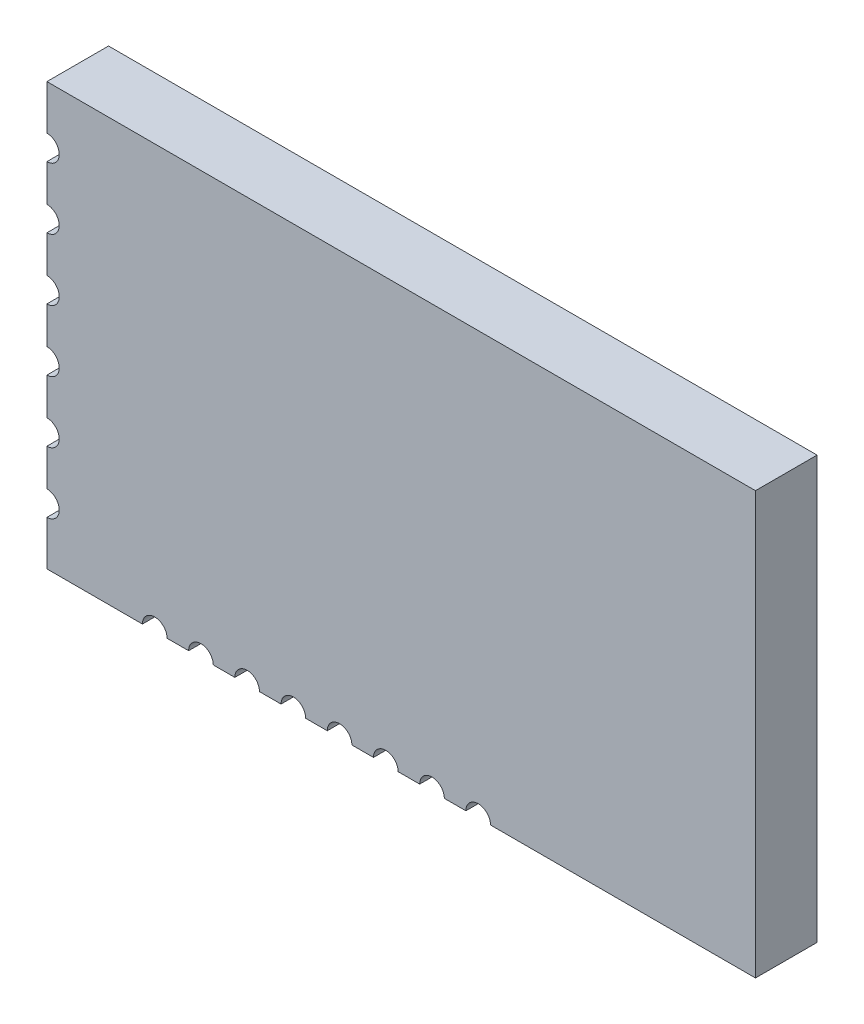
ISO-10303-21;
HEADER;
FILE_DESCRIPTION(('STEP AP214'),'2;1');
FILE_NAME('part.step','',(''),(''),'','','');
FILE_SCHEMA(('AUTOMOTIVE_DESIGN { 1 0 10303 214 1 1 1 1 }'));
ENDSEC;
DATA;
#1=APPLICATION_CONTEXT('core data for automotive mechanical design processes');
#2=APPLICATION_PROTOCOL_DEFINITION('international standard','automotive_design',2000,#1);
#3=PRODUCT_CONTEXT('',#1,'mechanical');
#4=PRODUCT('Part','Part','',(#3));
#5=PRODUCT_RELATED_PRODUCT_CATEGORY('part','',(#4));
#6=PRODUCT_DEFINITION_FORMATION('','',#4);
#7=PRODUCT_DEFINITION_CONTEXT('part definition',#1,'design');
#8=PRODUCT_DEFINITION('design','',#6,#7);
#9=PRODUCT_DEFINITION_SHAPE('','',#8);
#10=(LENGTH_UNIT() NAMED_UNIT(*) SI_UNIT(.MILLI.,.METRE.));
#11=(NAMED_UNIT(*) PLANE_ANGLE_UNIT() SI_UNIT($,.RADIAN.));
#12=(NAMED_UNIT(*) SI_UNIT($,.STERADIAN.) SOLID_ANGLE_UNIT());
#13=UNCERTAINTY_MEASURE_WITH_UNIT(LENGTH_MEASURE(1.E-05),#10,'distance_accuracy_value','');
#14=(GEOMETRIC_REPRESENTATION_CONTEXT(3) GLOBAL_UNCERTAINTY_ASSIGNED_CONTEXT((#13)) GLOBAL_UNIT_ASSIGNED_CONTEXT((#10,
#11,#12)) REPRESENTATION_CONTEXT('',''));
#15=CARTESIAN_POINT('',(0.,0.,0.));
#16=DIRECTION('',(0.,0.,1.));
#17=DIRECTION('',(1.,0.,0.));
#18=AXIS2_PLACEMENT_3D('',#15,#16,#17);
#19=CARTESIAN_POINT('',(13.4230639565293,-1.97559952597332,-2.));
#20=DIRECTION('',(-1.,0.,0.));
#21=DIRECTION('',(0.,0.,1.));
#22=AXIS2_PLACEMENT_3D('',#19,#20,#21);
#23=PLANE('',#22);
#24=DIRECTION('',(0.,-1.,0.));
#25=VECTOR('',#24,1.);
#26=CARTESIAN_POINT('',(13.4230639565293,-1.97559952597332,0.));
#27=LINE('',#26,#25);
#28=CARTESIAN_POINT('',(13.4230639565293,11.7244004740267,0.));
#29=VERTEX_POINT('',#28);
#30=CARTESIAN_POINT('',(13.4230639565293,-1.97559952597332,0.));
#31=VERTEX_POINT('',#30);
#32=EDGE_CURVE('E273',#29,#31,#27,.T.);
#33=ORIENTED_EDGE('',*,*,#32,.T.);
#34=DIRECTION('',(0.,0.,1.));
#35=VECTOR('',#34,1.);
#36=CARTESIAN_POINT('',(13.4230639565293,-1.97559952597332,-2.));
#37=LINE('',#36,#35);
#38=CARTESIAN_POINT('',(13.4230639565293,-1.97559952597332,-2.));
#39=VERTEX_POINT('',#38);
#40=EDGE_CURVE('E11',#39,#31,#37,.T.);
#41=ORIENTED_EDGE('',*,*,#40,.F.);
#42=DIRECTION('',(0.,-1.,0.));
#43=VECTOR('',#42,1.);
#44=CARTESIAN_POINT('',(13.4230639565293,-1.97559952597332,-2.));
#45=LINE('',#44,#43);
#46=CARTESIAN_POINT('',(13.4230639565293,11.7244004740267,-2.));
#47=VERTEX_POINT('',#46);
#48=EDGE_CURVE('E335',#47,#39,#45,.T.);
#49=ORIENTED_EDGE('',*,*,#48,.F.);
#50=DIRECTION('',(0.,0.,1.));
#51=VECTOR('',#50,1.);
#52=CARTESIAN_POINT('',(13.4230639565293,11.7244004740267,-2.));
#53=LINE('',#52,#51);
#54=EDGE_CURVE('E269',#47,#29,#53,.T.);
#55=ORIENTED_EDGE('',*,*,#54,.T.);
#56=EDGE_LOOP('',(#33,#41,#49,#55));
#57=FACE_BOUND('',#56,.T.);
#58=ADVANCED_FACE('F33',(#57),#23,.F.);
#59=CARTESIAN_POINT('',(13.4230639565293,-1.97559952597332,-2.));
#60=DIRECTION('',(0.,1.,0.));
#61=DIRECTION('',(-1.,0.,0.));
#62=AXIS2_PLACEMENT_3D('',#59,#60,#61);
#63=PLANE('',#62);
#64=DIRECTION('',(-1.,0.,0.));
#65=VECTOR('',#64,1.);
#66=CARTESIAN_POINT('',(13.4230639565293,-1.97559952597332,0.));
#67=LINE('',#66,#65);
#68=CARTESIAN_POINT('',(4.82306395652932,-1.97559952597332,0.));
#69=VERTEX_POINT('',#68);
#70=EDGE_CURVE('E276',#31,#69,#67,.T.);
#71=ORIENTED_EDGE('',*,*,#70,.T.);
#72=DIRECTION('',(0.,0.,1.));
#73=VECTOR('',#72,1.);
#74=CARTESIAN_POINT('',(4.82306395652932,-1.97559952597332,-2.));
#75=LINE('',#74,#73);
#76=CARTESIAN_POINT('',(4.82306395652932,-1.97559952597332,-2.));
#77=VERTEX_POINT('',#76);
#78=EDGE_CURVE('E41',#77,#69,#75,.T.);
#79=ORIENTED_EDGE('',*,*,#78,.F.);
#80=DIRECTION('',(-1.,0.,0.));
#81=VECTOR('',#80,1.);
#82=CARTESIAN_POINT('',(13.4230639565293,-1.97559952597332,-2.));
#83=LINE('',#82,#81);
#84=EDGE_CURVE('E164',#39,#77,#83,.T.);
#85=ORIENTED_EDGE('',*,*,#84,.F.);
#86=ORIENTED_EDGE('',*,*,#40,.T.);
#87=EDGE_LOOP('',(#71,#79,#85,#86));
#88=FACE_BOUND('',#87,.T.);
#89=ADVANCED_FACE('F513',(#88),#63,.F.);
#90=CARTESIAN_POINT('',(4.42306395652932,-1.97559952597332,-2.));
#91=DIRECTION('',(0.,0.,1.));
#92=DIRECTION('',(1.,0.,0.));
#93=AXIS2_PLACEMENT_3D('',#90,#91,#92);
#94=CYLINDRICAL_SURFACE('',#93,0.4);
#95=CARTESIAN_POINT('',(4.42306395652932,-1.97559952597332,0.));
#96=DIRECTION('',(0.,0.,1.));
#97=DIRECTION('',(-1.,0.,0.));
#98=AXIS2_PLACEMENT_3D('',#95,#96,#97);
#99=CIRCLE('',#98,0.4);
#100=CARTESIAN_POINT('',(4.02306395652932,-1.97559952597332,0.));
#101=VERTEX_POINT('',#100);
#102=EDGE_CURVE('E278',#69,#101,#99,.T.);
#103=ORIENTED_EDGE('',*,*,#102,.T.);
#104=DIRECTION('',(0.,0.,1.));
#105=VECTOR('',#104,1.);
#106=CARTESIAN_POINT('',(4.02306395652932,-1.97559952597332,-2.));
#107=LINE('',#106,#105);
#108=CARTESIAN_POINT('',(4.02306395652932,-1.97559952597332,-2.));
#109=VERTEX_POINT('',#108);
#110=EDGE_CURVE('E414',#109,#101,#107,.T.);
#111=ORIENTED_EDGE('',*,*,#110,.F.);
#112=CARTESIAN_POINT('',(4.42306395652932,-1.97559952597332,-2.));
#113=DIRECTION('',(0.,0.,1.));
#114=DIRECTION('',(-1.,0.,0.));
#115=AXIS2_PLACEMENT_3D('',#112,#113,#114);
#116=CIRCLE('',#115,0.4);
#117=EDGE_CURVE('E422',#77,#109,#116,.T.);
#118=ORIENTED_EDGE('',*,*,#117,.F.);
#119=ORIENTED_EDGE('',*,*,#78,.T.);
#120=EDGE_LOOP('',(#103,#111,#118,#119));
#121=FACE_BOUND('',#120,.T.);
#122=ADVANCED_FACE('F420',(#121),#94,.F.);
#123=CARTESIAN_POINT('',(4.02306395652932,-1.97559952597332,-2.));
#124=DIRECTION('',(0.,1.,0.));
#125=DIRECTION('',(0.,0.,1.));
#126=AXIS2_PLACEMENT_3D('',#123,#124,#125);
#127=PLANE('',#126);
#128=DIRECTION('',(-1.,0.,0.));
#129=VECTOR('',#128,1.);
#130=CARTESIAN_POINT('',(4.02306395652932,-1.97559952597332,0.));
#131=LINE('',#130,#129);
#132=CARTESIAN_POINT('',(3.32306395652932,-1.97559952597332,0.));
#133=VERTEX_POINT('',#132);
#134=EDGE_CURVE('E280',#101,#133,#131,.T.);
#135=ORIENTED_EDGE('',*,*,#134,.T.);
#136=DIRECTION('',(0.,0.,1.));
#137=VECTOR('',#136,1.);
#138=CARTESIAN_POINT('',(3.32306395652932,-1.97559952597332,-2.));
#139=LINE('',#138,#137);
#140=CARTESIAN_POINT('',(3.32306395652932,-1.97559952597332,-2.));
#141=VERTEX_POINT('',#140);
#142=EDGE_CURVE('E411',#141,#133,#139,.T.);
#143=ORIENTED_EDGE('',*,*,#142,.F.);
#144=DIRECTION('',(-1.,0.,0.));
#145=VECTOR('',#144,1.);
#146=CARTESIAN_POINT('',(4.02306395652932,-1.97559952597332,-2.));
#147=LINE('',#146,#145);
#148=EDGE_CURVE('E440',#109,#141,#147,.T.);
#149=ORIENTED_EDGE('',*,*,#148,.F.);
#150=ORIENTED_EDGE('',*,*,#110,.T.);
#151=EDGE_LOOP('',(#135,#143,#149,#150));
#152=FACE_BOUND('',#151,.T.);
#153=ADVANCED_FACE('F431',(#152),#127,.F.);
#154=CARTESIAN_POINT('',(2.92306395652932,-1.97559952597332,-2.));
#155=DIRECTION('',(0.,0.,1.));
#156=DIRECTION('',(1.,0.,0.));
#157=AXIS2_PLACEMENT_3D('',#154,#155,#156);
#158=CYLINDRICAL_SURFACE('',#157,0.400000000000001);
#159=CARTESIAN_POINT('',(2.92306395652932,-1.97559952597332,0.));
#160=DIRECTION('',(0.,0.,1.));
#161=DIRECTION('',(-1.,0.,0.));
#162=AXIS2_PLACEMENT_3D('',#159,#160,#161);
#163=CIRCLE('',#162,0.400000000000001);
#164=CARTESIAN_POINT('',(2.52306395652932,-1.97559952597332,0.));
#165=VERTEX_POINT('',#164);
#166=EDGE_CURVE('E282',#133,#165,#163,.T.);
#167=ORIENTED_EDGE('',*,*,#166,.T.);
#168=DIRECTION('',(0.,0.,1.));
#169=VECTOR('',#168,1.);
#170=CARTESIAN_POINT('',(2.52306395652932,-1.97559952597332,-2.));
#171=LINE('',#170,#169);
#172=CARTESIAN_POINT('',(2.52306395652932,-1.97559952597332,-2.));
#173=VERTEX_POINT('',#172);
#174=EDGE_CURVE('E408',#173,#165,#171,.T.);
#175=ORIENTED_EDGE('',*,*,#174,.F.);
#176=CARTESIAN_POINT('',(2.92306395652932,-1.97559952597332,-2.));
#177=DIRECTION('',(0.,0.,1.));
#178=DIRECTION('',(-1.,0.,0.));
#179=AXIS2_PLACEMENT_3D('',#176,#177,#178);
#180=CIRCLE('',#179,0.400000000000001);
#181=EDGE_CURVE('E437',#141,#173,#180,.T.);
#182=ORIENTED_EDGE('',*,*,#181,.F.);
#183=ORIENTED_EDGE('',*,*,#142,.T.);
#184=EDGE_LOOP('',(#167,#175,#182,#183));
#185=FACE_BOUND('',#184,.T.);
#186=ADVANCED_FACE('F435',(#185),#158,.F.);
#187=CARTESIAN_POINT('',(2.52306395652932,-1.97559952597332,-2.));
#188=DIRECTION('',(0.,1.,0.));
#189=DIRECTION('',(0.,0.,1.));
#190=AXIS2_PLACEMENT_3D('',#187,#188,#189);
#191=PLANE('',#190);
#192=DIRECTION('',(-1.,0.,0.));
#193=VECTOR('',#192,1.);
#194=CARTESIAN_POINT('',(2.52306395652932,-1.97559952597332,0.));
#195=LINE('',#194,#193);
#196=CARTESIAN_POINT('',(1.82306395652932,-1.97559952597332,0.));
#197=VERTEX_POINT('',#196);
#198=EDGE_CURVE('E284',#165,#197,#195,.T.);
#199=ORIENTED_EDGE('',*,*,#198,.T.);
#200=DIRECTION('',(0.,0.,1.));
#201=VECTOR('',#200,1.);
#202=CARTESIAN_POINT('',(1.82306395652932,-1.97559952597332,-2.));
#203=LINE('',#202,#201);
#204=CARTESIAN_POINT('',(1.82306395652932,-1.97559952597332,-2.));
#205=VERTEX_POINT('',#204);
#206=EDGE_CURVE('E405',#205,#197,#203,.T.);
#207=ORIENTED_EDGE('',*,*,#206,.F.);
#208=DIRECTION('',(-1.,0.,0.));
#209=VECTOR('',#208,1.);
#210=CARTESIAN_POINT('',(2.52306395652932,-1.97559952597332,-2.));
#211=LINE('',#210,#209);
#212=EDGE_CURVE('E439',#173,#205,#211,.T.);
#213=ORIENTED_EDGE('',*,*,#212,.F.);
#214=ORIENTED_EDGE('',*,*,#174,.T.);
#215=EDGE_LOOP('',(#199,#207,#213,#214));
#216=FACE_BOUND('',#215,.T.);
#217=ADVANCED_FACE('F526',(#216),#191,.F.);
#218=CARTESIAN_POINT('',(1.42306395652932,-1.97559952597332,-2.));
#219=DIRECTION('',(0.,0.,1.));
#220=DIRECTION('',(1.,0.,0.));
#221=AXIS2_PLACEMENT_3D('',#218,#219,#220);
#222=CYLINDRICAL_SURFACE('',#221,0.4);
#223=CARTESIAN_POINT('',(1.42306395652932,-1.97559952597332,0.));
#224=DIRECTION('',(0.,0.,1.));
#225=DIRECTION('',(-1.,0.,0.));
#226=AXIS2_PLACEMENT_3D('',#223,#224,#225);
#227=CIRCLE('',#226,0.4);
#228=CARTESIAN_POINT('',(1.02306395652932,-1.97559952597332,0.));
#229=VERTEX_POINT('',#228);
#230=EDGE_CURVE('E286',#197,#229,#227,.T.);
#231=ORIENTED_EDGE('',*,*,#230,.T.);
#232=DIRECTION('',(0.,0.,1.));
#233=VECTOR('',#232,1.);
#234=CARTESIAN_POINT('',(1.02306395652932,-1.97559952597332,-2.));
#235=LINE('',#234,#233);
#236=CARTESIAN_POINT('',(1.02306395652932,-1.97559952597332,-2.));
#237=VERTEX_POINT('',#236);
#238=EDGE_CURVE('E402',#237,#229,#235,.T.);
#239=ORIENTED_EDGE('',*,*,#238,.F.);
#240=CARTESIAN_POINT('',(1.42306395652932,-1.97559952597332,-2.));
#241=DIRECTION('',(0.,0.,1.));
#242=DIRECTION('',(-1.,0.,0.));
#243=AXIS2_PLACEMENT_3D('',#240,#241,#242);
#244=CIRCLE('',#243,0.4);
#245=EDGE_CURVE('E442',#205,#237,#244,.T.);
#246=ORIENTED_EDGE('',*,*,#245,.F.);
#247=ORIENTED_EDGE('',*,*,#206,.T.);
#248=EDGE_LOOP('',(#231,#239,#246,#247));
#249=FACE_BOUND('',#248,.T.);
#250=ADVANCED_FACE('F529',(#249),#222,.F.);
#251=CARTESIAN_POINT('',(1.02306395652932,-1.97559952597332,-2.));
#252=DIRECTION('',(0.,1.,0.));
#253=DIRECTION('',(0.,0.,1.));
#254=AXIS2_PLACEMENT_3D('',#251,#252,#253);
#255=PLANE('',#254);
#256=DIRECTION('',(-1.,0.,0.));
#257=VECTOR('',#256,1.);
#258=CARTESIAN_POINT('',(1.02306395652932,-1.97559952597332,0.));
#259=LINE('',#258,#257);
#260=CARTESIAN_POINT('',(0.323063956529324,-1.97559952597332,0.));
#261=VERTEX_POINT('',#260);
#262=EDGE_CURVE('E288',#229,#261,#259,.T.);
#263=ORIENTED_EDGE('',*,*,#262,.T.);
#264=DIRECTION('',(0.,0.,1.));
#265=VECTOR('',#264,1.);
#266=CARTESIAN_POINT('',(0.323063956529324,-1.97559952597332,-2.));
#267=LINE('',#266,#265);
#268=CARTESIAN_POINT('',(0.323063956529324,-1.97559952597332,-2.));
#269=VERTEX_POINT('',#268);
#270=EDGE_CURVE('E399',#269,#261,#267,.T.);
#271=ORIENTED_EDGE('',*,*,#270,.F.);
#272=DIRECTION('',(-1.,0.,0.));
#273=VECTOR('',#272,1.);
#274=CARTESIAN_POINT('',(1.02306395652932,-1.97559952597332,-2.));
#275=LINE('',#274,#273);
#276=EDGE_CURVE('E448',#237,#269,#275,.T.);
#277=ORIENTED_EDGE('',*,*,#276,.F.);
#278=ORIENTED_EDGE('',*,*,#238,.T.);
#279=EDGE_LOOP('',(#263,#271,#277,#278));
#280=FACE_BOUND('',#279,.T.);
#281=ADVANCED_FACE('F533',(#280),#255,.F.);
#282=CARTESIAN_POINT('',(-0.0769360434706764,-1.97559952597332,-2.));
#283=DIRECTION('',(0.,0.,1.));
#284=DIRECTION('',(1.,0.,0.));
#285=AXIS2_PLACEMENT_3D('',#282,#283,#284);
#286=CYLINDRICAL_SURFACE('',#285,0.4);
#287=CARTESIAN_POINT('',(-0.0769360434706764,-1.97559952597332,0.));
#288=DIRECTION('',(0.,0.,1.));
#289=DIRECTION('',(-1.,0.,0.));
#290=AXIS2_PLACEMENT_3D('',#287,#288,#289);
#291=CIRCLE('',#290,0.4);
#292=CARTESIAN_POINT('',(-0.476936043470677,-1.97559952597332,0.));
#293=VERTEX_POINT('',#292);
#294=EDGE_CURVE('E290',#261,#293,#291,.T.);
#295=ORIENTED_EDGE('',*,*,#294,.T.);
#296=DIRECTION('',(0.,0.,1.));
#297=VECTOR('',#296,1.);
#298=CARTESIAN_POINT('',(-0.476936043470677,-1.97559952597332,-2.));
#299=LINE('',#298,#297);
#300=CARTESIAN_POINT('',(-0.476936043470677,-1.97559952597332,-2.));
#301=VERTEX_POINT('',#300);
#302=EDGE_CURVE('E396',#301,#293,#299,.T.);
#303=ORIENTED_EDGE('',*,*,#302,.F.);
#304=CARTESIAN_POINT('',(-0.0769360434706764,-1.97559952597332,-2.));
#305=DIRECTION('',(0.,0.,1.));
#306=DIRECTION('',(-1.,0.,0.));
#307=AXIS2_PLACEMENT_3D('',#304,#305,#306);
#308=CIRCLE('',#307,0.4);
#309=EDGE_CURVE('E450',#269,#301,#308,.T.);
#310=ORIENTED_EDGE('',*,*,#309,.F.);
#311=ORIENTED_EDGE('',*,*,#270,.T.);
#312=EDGE_LOOP('',(#295,#303,#310,#311));
#313=FACE_BOUND('',#312,.T.);
#314=ADVANCED_FACE('F537',(#313),#286,.F.);
#315=CARTESIAN_POINT('',(-0.476936043470677,-1.97559952597332,-2.));
#316=DIRECTION('',(0.,1.,0.));
#317=DIRECTION('',(0.,0.,1.));
#318=AXIS2_PLACEMENT_3D('',#315,#316,#317);
#319=PLANE('',#318);
#320=DIRECTION('',(-1.,0.,0.));
#321=VECTOR('',#320,1.);
#322=CARTESIAN_POINT('',(-0.476936043470677,-1.97559952597332,0.));
#323=LINE('',#322,#321);
#324=CARTESIAN_POINT('',(-1.17693604347068,-1.97559952597332,0.));
#325=VERTEX_POINT('',#324);
#326=EDGE_CURVE('E292',#293,#325,#323,.T.);
#327=ORIENTED_EDGE('',*,*,#326,.T.);
#328=DIRECTION('',(0.,0.,1.));
#329=VECTOR('',#328,1.);
#330=CARTESIAN_POINT('',(-1.17693604347068,-1.97559952597332,-2.));
#331=LINE('',#330,#329);
#332=CARTESIAN_POINT('',(-1.17693604347068,-1.97559952597332,-2.));
#333=VERTEX_POINT('',#332);
#334=EDGE_CURVE('E393',#333,#325,#331,.T.);
#335=ORIENTED_EDGE('',*,*,#334,.F.);
#336=DIRECTION('',(-1.,0.,0.));
#337=VECTOR('',#336,1.);
#338=CARTESIAN_POINT('',(-0.476936043470677,-1.97559952597332,-2.));
#339=LINE('',#338,#337);
#340=EDGE_CURVE('E452',#301,#333,#339,.T.);
#341=ORIENTED_EDGE('',*,*,#340,.F.);
#342=ORIENTED_EDGE('',*,*,#302,.T.);
#343=EDGE_LOOP('',(#327,#335,#341,#342));
#344=FACE_BOUND('',#343,.T.);
#345=ADVANCED_FACE('F541',(#344),#319,.F.);
#346=CARTESIAN_POINT('',(-1.57693604347068,-1.97559952597332,-2.));
#347=DIRECTION('',(0.,0.,1.));
#348=DIRECTION('',(1.,0.,0.));
#349=AXIS2_PLACEMENT_3D('',#346,#347,#348);
#350=CYLINDRICAL_SURFACE('',#349,0.400000000000001);
#351=CARTESIAN_POINT('',(-1.57693604347068,-1.97559952597332,0.));
#352=DIRECTION('',(0.,0.,1.));
#353=DIRECTION('',(-1.,0.,0.));
#354=AXIS2_PLACEMENT_3D('',#351,#352,#353);
#355=CIRCLE('',#354,0.400000000000001);
#356=CARTESIAN_POINT('',(-1.97693604347068,-1.97559952597332,0.));
#357=VERTEX_POINT('',#356);
#358=EDGE_CURVE('E294',#325,#357,#355,.T.);
#359=ORIENTED_EDGE('',*,*,#358,.T.);
#360=DIRECTION('',(0.,0.,1.));
#361=VECTOR('',#360,1.);
#362=CARTESIAN_POINT('',(-1.97693604347068,-1.97559952597332,-2.));
#363=LINE('',#362,#361);
#364=CARTESIAN_POINT('',(-1.97693604347068,-1.97559952597332,-2.));
#365=VERTEX_POINT('',#364);
#366=EDGE_CURVE('E390',#365,#357,#363,.T.);
#367=ORIENTED_EDGE('',*,*,#366,.F.);
#368=CARTESIAN_POINT('',(-1.57693604347068,-1.97559952597332,-2.));
#369=DIRECTION('',(0.,0.,1.));
#370=DIRECTION('',(-1.,0.,0.));
#371=AXIS2_PLACEMENT_3D('',#368,#369,#370);
#372=CIRCLE('',#371,0.400000000000001);
#373=EDGE_CURVE('E454',#333,#365,#372,.T.);
#374=ORIENTED_EDGE('',*,*,#373,.F.);
#375=ORIENTED_EDGE('',*,*,#334,.T.);
#376=EDGE_LOOP('',(#359,#367,#374,#375));
#377=FACE_BOUND('',#376,.T.);
#378=ADVANCED_FACE('F545',(#377),#350,.F.);
#379=CARTESIAN_POINT('',(-1.97693604347068,-1.97559952597332,-2.));
#380=DIRECTION('',(0.,1.,0.));
#381=DIRECTION('',(0.,0.,1.));
#382=AXIS2_PLACEMENT_3D('',#379,#380,#381);
#383=PLANE('',#382);
#384=DIRECTION('',(-1.,0.,0.));
#385=VECTOR('',#384,1.);
#386=CARTESIAN_POINT('',(-1.97693604347068,-1.97559952597332,0.));
#387=LINE('',#386,#385);
#388=CARTESIAN_POINT('',(-2.67693604347068,-1.97559952597332,0.));
#389=VERTEX_POINT('',#388);
#390=EDGE_CURVE('E296',#357,#389,#387,.T.);
#391=ORIENTED_EDGE('',*,*,#390,.T.);
#392=DIRECTION('',(0.,0.,1.));
#393=VECTOR('',#392,1.);
#394=CARTESIAN_POINT('',(-2.67693604347068,-1.97559952597332,-2.));
#395=LINE('',#394,#393);
#396=CARTESIAN_POINT('',(-2.67693604347068,-1.97559952597332,-2.));
#397=VERTEX_POINT('',#396);
#398=EDGE_CURVE('E387',#397,#389,#395,.T.);
#399=ORIENTED_EDGE('',*,*,#398,.F.);
#400=DIRECTION('',(-1.,0.,0.));
#401=VECTOR('',#400,1.);
#402=CARTESIAN_POINT('',(-1.97693604347068,-1.97559952597332,-2.));
#403=LINE('',#402,#401);
#404=EDGE_CURVE('E456',#365,#397,#403,.T.);
#405=ORIENTED_EDGE('',*,*,#404,.F.);
#406=ORIENTED_EDGE('',*,*,#366,.T.);
#407=EDGE_LOOP('',(#391,#399,#405,#406));
#408=FACE_BOUND('',#407,.T.);
#409=ADVANCED_FACE('F549',(#408),#383,.F.);
#410=CARTESIAN_POINT('',(-3.07693604347068,-1.97559952597332,-2.));
#411=DIRECTION('',(0.,0.,1.));
#412=DIRECTION('',(1.,0.,0.));
#413=AXIS2_PLACEMENT_3D('',#410,#411,#412);
#414=CYLINDRICAL_SURFACE('',#413,0.400000000000001);
#415=CARTESIAN_POINT('',(-3.07693604347068,-1.97559952597332,0.));
#416=DIRECTION('',(0.,0.,1.));
#417=DIRECTION('',(-1.,0.,0.));
#418=AXIS2_PLACEMENT_3D('',#415,#416,#417);
#419=CIRCLE('',#418,0.400000000000001);
#420=CARTESIAN_POINT('',(-3.47693604347068,-1.97559952597332,0.));
#421=VERTEX_POINT('',#420);
#422=EDGE_CURVE('E298',#389,#421,#419,.T.);
#423=ORIENTED_EDGE('',*,*,#422,.T.);
#424=DIRECTION('',(0.,0.,1.));
#425=VECTOR('',#424,1.);
#426=CARTESIAN_POINT('',(-3.47693604347068,-1.97559952597332,-2.));
#427=LINE('',#426,#425);
#428=CARTESIAN_POINT('',(-3.47693604347068,-1.97559952597332,-2.));
#429=VERTEX_POINT('',#428);
#430=EDGE_CURVE('E384',#429,#421,#427,.T.);
#431=ORIENTED_EDGE('',*,*,#430,.F.);
#432=CARTESIAN_POINT('',(-3.07693604347068,-1.97559952597332,-2.));
#433=DIRECTION('',(0.,0.,1.));
#434=DIRECTION('',(-1.,0.,0.));
#435=AXIS2_PLACEMENT_3D('',#432,#433,#434);
#436=CIRCLE('',#435,0.400000000000001);
#437=EDGE_CURVE('E458',#397,#429,#436,.T.);
#438=ORIENTED_EDGE('',*,*,#437,.F.);
#439=ORIENTED_EDGE('',*,*,#398,.T.);
#440=EDGE_LOOP('',(#423,#431,#438,#439));
#441=FACE_BOUND('',#440,.T.);
#442=ADVANCED_FACE('F553',(#441),#414,.F.);
#443=CARTESIAN_POINT('',(-3.47693604347068,-1.97559952597332,-2.));
#444=DIRECTION('',(0.,1.,0.));
#445=DIRECTION('',(0.,0.,1.));
#446=AXIS2_PLACEMENT_3D('',#443,#444,#445);
#447=PLANE('',#446);
#448=DIRECTION('',(-1.,0.,0.));
#449=VECTOR('',#448,1.);
#450=CARTESIAN_POINT('',(-3.47693604347068,-1.97559952597332,0.));
#451=LINE('',#450,#449);
#452=CARTESIAN_POINT('',(-4.17693604347068,-1.97559952597332,0.));
#453=VERTEX_POINT('',#452);
#454=EDGE_CURVE('E300',#421,#453,#451,.T.);
#455=ORIENTED_EDGE('',*,*,#454,.T.);
#456=DIRECTION('',(0.,0.,1.));
#457=VECTOR('',#456,1.);
#458=CARTESIAN_POINT('',(-4.17693604347068,-1.97559952597332,-2.));
#459=LINE('',#458,#457);
#460=CARTESIAN_POINT('',(-4.17693604347068,-1.97559952597332,-2.));
#461=VERTEX_POINT('',#460);
#462=EDGE_CURVE('E381',#461,#453,#459,.T.);
#463=ORIENTED_EDGE('',*,*,#462,.F.);
#464=DIRECTION('',(-1.,0.,0.));
#465=VECTOR('',#464,1.);
#466=CARTESIAN_POINT('',(-3.47693604347068,-1.97559952597332,-2.));
#467=LINE('',#466,#465);
#468=EDGE_CURVE('E460',#429,#461,#467,.T.);
#469=ORIENTED_EDGE('',*,*,#468,.F.);
#470=ORIENTED_EDGE('',*,*,#430,.T.);
#471=EDGE_LOOP('',(#455,#463,#469,#470));
#472=FACE_BOUND('',#471,.T.);
#473=ADVANCED_FACE('F557',(#472),#447,.F.);
#474=CARTESIAN_POINT('',(-4.57693604347068,-1.97559952597332,-2.));
#475=DIRECTION('',(0.,0.,1.));
#476=DIRECTION('',(1.,0.,0.));
#477=AXIS2_PLACEMENT_3D('',#474,#475,#476);
#478=CYLINDRICAL_SURFACE('',#477,0.4);
#479=CARTESIAN_POINT('',(-4.57693604347068,-1.97559952597332,0.));
#480=DIRECTION('',(0.,0.,1.));
#481=DIRECTION('',(-1.,0.,0.));
#482=AXIS2_PLACEMENT_3D('',#479,#480,#481);
#483=CIRCLE('',#482,0.4);
#484=CARTESIAN_POINT('',(-4.97693604347068,-1.97559952597332,0.));
#485=VERTEX_POINT('',#484);
#486=EDGE_CURVE('E302',#453,#485,#483,.T.);
#487=ORIENTED_EDGE('',*,*,#486,.T.);
#488=DIRECTION('',(0.,0.,1.));
#489=VECTOR('',#488,1.);
#490=CARTESIAN_POINT('',(-4.97693604347068,-1.97559952597332,-2.));
#491=LINE('',#490,#489);
#492=CARTESIAN_POINT('',(-4.97693604347068,-1.97559952597332,-2.));
#493=VERTEX_POINT('',#492);
#494=EDGE_CURVE('E378',#493,#485,#491,.T.);
#495=ORIENTED_EDGE('',*,*,#494,.F.);
#496=CARTESIAN_POINT('',(-4.57693604347068,-1.97559952597332,-2.));
#497=DIRECTION('',(0.,0.,1.));
#498=DIRECTION('',(-1.,0.,0.));
#499=AXIS2_PLACEMENT_3D('',#496,#497,#498);
#500=CIRCLE('',#499,0.4);
#501=EDGE_CURVE('E462',#461,#493,#500,.T.);
#502=ORIENTED_EDGE('',*,*,#501,.F.);
#503=ORIENTED_EDGE('',*,*,#462,.T.);
#504=EDGE_LOOP('',(#487,#495,#502,#503));
#505=FACE_BOUND('',#504,.T.);
#506=ADVANCED_FACE('F561',(#505),#478,.F.);
#507=CARTESIAN_POINT('',(-4.97693604347068,-1.97559952597332,-2.));
#508=DIRECTION('',(0.,1.,0.));
#509=DIRECTION('',(0.,0.,1.));
#510=AXIS2_PLACEMENT_3D('',#507,#508,#509);
#511=PLANE('',#510);
#512=DIRECTION('',(-1.,0.,0.));
#513=VECTOR('',#512,1.);
#514=CARTESIAN_POINT('',(-4.97693604347068,-1.97559952597332,0.));
#515=LINE('',#514,#513);
#516=CARTESIAN_POINT('',(-5.67693604347068,-1.97559952597332,0.));
#517=VERTEX_POINT('',#516);
#518=EDGE_CURVE('E304',#485,#517,#515,.T.);
#519=ORIENTED_EDGE('',*,*,#518,.T.);
#520=DIRECTION('',(0.,0.,1.));
#521=VECTOR('',#520,1.);
#522=CARTESIAN_POINT('',(-5.67693604347068,-1.97559952597332,-2.));
#523=LINE('',#522,#521);
#524=CARTESIAN_POINT('',(-5.67693604347068,-1.97559952597332,-2.));
#525=VERTEX_POINT('',#524);
#526=EDGE_CURVE('E375',#525,#517,#523,.T.);
#527=ORIENTED_EDGE('',*,*,#526,.F.);
#528=DIRECTION('',(-1.,0.,0.));
#529=VECTOR('',#528,1.);
#530=CARTESIAN_POINT('',(-4.97693604347068,-1.97559952597332,-2.));
#531=LINE('',#530,#529);
#532=EDGE_CURVE('E464',#493,#525,#531,.T.);
#533=ORIENTED_EDGE('',*,*,#532,.F.);
#534=ORIENTED_EDGE('',*,*,#494,.T.);
#535=EDGE_LOOP('',(#519,#527,#533,#534));
#536=FACE_BOUND('',#535,.T.);
#537=ADVANCED_FACE('F565',(#536),#511,.F.);
#538=CARTESIAN_POINT('',(-6.07693604347068,-1.97559952597332,-2.));
#539=DIRECTION('',(0.,0.,1.));
#540=DIRECTION('',(1.,0.,0.));
#541=AXIS2_PLACEMENT_3D('',#538,#539,#540);
#542=CYLINDRICAL_SURFACE('',#541,0.4);
#543=CARTESIAN_POINT('',(-6.07693604347068,-1.97559952597332,0.));
#544=DIRECTION('',(0.,0.,1.));
#545=DIRECTION('',(-1.,0.,0.));
#546=AXIS2_PLACEMENT_3D('',#543,#544,#545);
#547=CIRCLE('',#546,0.4);
#548=CARTESIAN_POINT('',(-6.47693604347068,-1.97559952597332,0.));
#549=VERTEX_POINT('',#548);
#550=EDGE_CURVE('E306',#517,#549,#547,.T.);
#551=ORIENTED_EDGE('',*,*,#550,.T.);
#552=DIRECTION('',(0.,0.,1.));
#553=VECTOR('',#552,1.);
#554=CARTESIAN_POINT('',(-6.47693604347068,-1.97559952597332,-2.));
#555=LINE('',#554,#553);
#556=CARTESIAN_POINT('',(-6.47693604347068,-1.97559952597332,-2.));
#557=VERTEX_POINT('',#556);
#558=EDGE_CURVE('E372',#557,#549,#555,.T.);
#559=ORIENTED_EDGE('',*,*,#558,.F.);
#560=CARTESIAN_POINT('',(-6.07693604347068,-1.97559952597332,-2.));
#561=DIRECTION('',(0.,0.,1.));
#562=DIRECTION('',(-1.,0.,0.));
#563=AXIS2_PLACEMENT_3D('',#560,#561,#562);
#564=CIRCLE('',#563,0.4);
#565=EDGE_CURVE('E466',#525,#557,#564,.T.);
#566=ORIENTED_EDGE('',*,*,#565,.F.);
#567=ORIENTED_EDGE('',*,*,#526,.T.);
#568=EDGE_LOOP('',(#551,#559,#566,#567));
#569=FACE_BOUND('',#568,.T.);
#570=ADVANCED_FACE('F569',(#569),#542,.F.);
#571=CARTESIAN_POINT('',(-6.47693604347068,-1.97559952597332,-2.));
#572=DIRECTION('',(0.,1.,0.));
#573=DIRECTION('',(-1.,0.,0.));
#574=AXIS2_PLACEMENT_3D('',#571,#572,#573);
#575=PLANE('',#574);
#576=DIRECTION('',(-1.,0.,0.));
#577=VECTOR('',#576,1.);
#578=CARTESIAN_POINT('',(-6.47693604347068,-1.97559952597332,0.));
#579=LINE('',#578,#577);
#580=CARTESIAN_POINT('',(-9.57693604347068,-1.97559952597332,0.));
#581=VERTEX_POINT('',#580);
#582=EDGE_CURVE('E308',#549,#581,#579,.T.);
#583=ORIENTED_EDGE('',*,*,#582,.T.);
#584=DIRECTION('',(0.,0.,1.));
#585=VECTOR('',#584,1.);
#586=CARTESIAN_POINT('',(-9.57693604347068,-1.97559952597332,-2.));
#587=LINE('',#586,#585);
#588=CARTESIAN_POINT('',(-9.57693604347068,-1.97559952597332,-2.));
#589=VERTEX_POINT('',#588);
#590=EDGE_CURVE('E369',#589,#581,#587,.T.);
#591=ORIENTED_EDGE('',*,*,#590,.F.);
#592=DIRECTION('',(-1.,0.,0.));
#593=VECTOR('',#592,1.);
#594=CARTESIAN_POINT('',(-6.47693604347068,-1.97559952597332,-2.));
#595=LINE('',#594,#593);
#596=EDGE_CURVE('E468',#557,#589,#595,.T.);
#597=ORIENTED_EDGE('',*,*,#596,.F.);
#598=ORIENTED_EDGE('',*,*,#558,.T.);
#599=EDGE_LOOP('',(#583,#591,#597,#598));
#600=FACE_BOUND('',#599,.T.);
#601=ADVANCED_FACE('F573',(#600),#575,.F.);
#602=CARTESIAN_POINT('',(-9.57693604347068,-1.97559952597332,-2.));
#603=DIRECTION('',(1.,0.,0.));
#604=DIRECTION('',(0.,0.,-1.));
#605=AXIS2_PLACEMENT_3D('',#602,#603,#604);
#606=PLANE('',#605);
#607=DIRECTION('',(0.,1.,0.));
#608=VECTOR('',#607,1.);
#609=CARTESIAN_POINT('',(-9.57693604347068,-1.97559952597332,0.));
#610=LINE('',#609,#608);
#611=CARTESIAN_POINT('',(-9.57693604347068,-0.525599525973315,0.));
#612=VERTEX_POINT('',#611);
#613=EDGE_CURVE('E310',#581,#612,#610,.T.);
#614=ORIENTED_EDGE('',*,*,#613,.T.);
#615=DIRECTION('',(0.,0.,1.));
#616=VECTOR('',#615,1.);
#617=CARTESIAN_POINT('',(-9.57693604347068,-0.525599525973315,-2.));
#618=LINE('',#617,#616);
#619=CARTESIAN_POINT('',(-9.57693604347068,-0.525599525973315,-2.));
#620=VERTEX_POINT('',#619);
#621=EDGE_CURVE('E366',#620,#612,#618,.T.);
#622=ORIENTED_EDGE('',*,*,#621,.F.);
#623=DIRECTION('',(0.,1.,0.));
#624=VECTOR('',#623,1.);
#625=CARTESIAN_POINT('',(-9.57693604347068,-1.97559952597332,-2.));
#626=LINE('',#625,#624);
#627=EDGE_CURVE('E470',#589,#620,#626,.T.);
#628=ORIENTED_EDGE('',*,*,#627,.F.);
#629=ORIENTED_EDGE('',*,*,#590,.T.);
#630=EDGE_LOOP('',(#614,#622,#628,#629));
#631=FACE_BOUND('',#630,.T.);
#632=ADVANCED_FACE('F577',(#631),#606,.F.);
#633=CARTESIAN_POINT('',(-9.57693604347078,-0.125599525973316,-2.));
#634=DIRECTION('',(0.,0.,1.));
#635=DIRECTION('',(1.,0.,0.));
#636=AXIS2_PLACEMENT_3D('',#633,#634,#635);
#637=CYLINDRICAL_SURFACE('',#636,0.4);
#638=CARTESIAN_POINT('',(-9.57693604347078,-0.125599525973316,0.));
#639=DIRECTION('',(0.,0.,1.));
#640=DIRECTION('',(-1.,0.,0.));
#641=AXIS2_PLACEMENT_3D('',#638,#639,#640);
#642=CIRCLE('',#641,0.4);
#643=CARTESIAN_POINT('',(-9.57693604347068,0.274400474026684,0.));
#644=VERTEX_POINT('',#643);
#645=EDGE_CURVE('E312',#612,#644,#642,.T.);
#646=ORIENTED_EDGE('',*,*,#645,.T.);
#647=DIRECTION('',(0.,0.,1.));
#648=VECTOR('',#647,1.);
#649=CARTESIAN_POINT('',(-9.57693604347068,0.274400474026684,-2.));
#650=LINE('',#649,#648);
#651=CARTESIAN_POINT('',(-9.57693604347068,0.274400474026684,-2.));
#652=VERTEX_POINT('',#651);
#653=EDGE_CURVE('E363',#652,#644,#650,.T.);
#654=ORIENTED_EDGE('',*,*,#653,.F.);
#655=CARTESIAN_POINT('',(-9.57693604347078,-0.125599525973316,-2.));
#656=DIRECTION('',(0.,0.,1.));
#657=DIRECTION('',(-1.,0.,0.));
#658=AXIS2_PLACEMENT_3D('',#655,#656,#657);
#659=CIRCLE('',#658,0.4);
#660=EDGE_CURVE('E472',#620,#652,#659,.T.);
#661=ORIENTED_EDGE('',*,*,#660,.F.);
#662=ORIENTED_EDGE('',*,*,#621,.T.);
#663=EDGE_LOOP('',(#646,#654,#661,#662));
#664=FACE_BOUND('',#663,.T.);
#665=ADVANCED_FACE('F581',(#664),#637,.F.);
#666=CARTESIAN_POINT('',(-9.57693604347068,0.274400474026684,-2.));
#667=DIRECTION('',(1.,0.,0.));
#668=DIRECTION('',(0.,0.,-1.));
#669=AXIS2_PLACEMENT_3D('',#666,#667,#668);
#670=PLANE('',#669);
#671=DIRECTION('',(0.,1.,0.));
#672=VECTOR('',#671,1.);
#673=CARTESIAN_POINT('',(-9.57693604347068,0.274400474026684,0.));
#674=LINE('',#673,#672);
#675=CARTESIAN_POINT('',(-9.57693604347068,1.47440047402668,0.));
#676=VERTEX_POINT('',#675);
#677=EDGE_CURVE('E314',#644,#676,#674,.T.);
#678=ORIENTED_EDGE('',*,*,#677,.T.);
#679=DIRECTION('',(0.,0.,1.));
#680=VECTOR('',#679,1.);
#681=CARTESIAN_POINT('',(-9.57693604347068,1.47440047402668,-2.));
#682=LINE('',#681,#680);
#683=CARTESIAN_POINT('',(-9.57693604347068,1.47440047402668,-2.));
#684=VERTEX_POINT('',#683);
#685=EDGE_CURVE('E360',#684,#676,#682,.T.);
#686=ORIENTED_EDGE('',*,*,#685,.F.);
#687=DIRECTION('',(0.,1.,0.));
#688=VECTOR('',#687,1.);
#689=CARTESIAN_POINT('',(-9.57693604347068,0.274400474026684,-2.));
#690=LINE('',#689,#688);
#691=EDGE_CURVE('E474',#652,#684,#690,.T.);
#692=ORIENTED_EDGE('',*,*,#691,.F.);
#693=ORIENTED_EDGE('',*,*,#653,.T.);
#694=EDGE_LOOP('',(#678,#686,#692,#693));
#695=FACE_BOUND('',#694,.T.);
#696=ADVANCED_FACE('F585',(#695),#670,.F.);
#697=CARTESIAN_POINT('',(-9.57693604347076,1.87440047402668,-2.));
#698=DIRECTION('',(0.,0.,1.));
#699=DIRECTION('',(1.,0.,0.));
#700=AXIS2_PLACEMENT_3D('',#697,#698,#699);
#701=CYLINDRICAL_SURFACE('',#700,0.399999999999999);
#702=CARTESIAN_POINT('',(-9.57693604347076,1.87440047402668,0.));
#703=DIRECTION('',(0.,0.,1.));
#704=DIRECTION('',(-1.,0.,0.));
#705=AXIS2_PLACEMENT_3D('',#702,#703,#704);
#706=CIRCLE('',#705,0.399999999999999);
#707=CARTESIAN_POINT('',(-9.57693604347068,2.27440047402668,0.));
#708=VERTEX_POINT('',#707);
#709=EDGE_CURVE('E316',#676,#708,#706,.T.);
#710=ORIENTED_EDGE('',*,*,#709,.T.);
#711=DIRECTION('',(0.,0.,1.));
#712=VECTOR('',#711,1.);
#713=CARTESIAN_POINT('',(-9.57693604347068,2.27440047402668,-2.));
#714=LINE('',#713,#712);
#715=CARTESIAN_POINT('',(-9.57693604347068,2.27440047402668,-2.));
#716=VERTEX_POINT('',#715);
#717=EDGE_CURVE('E357',#716,#708,#714,.T.);
#718=ORIENTED_EDGE('',*,*,#717,.F.);
#719=CARTESIAN_POINT('',(-9.57693604347076,1.87440047402668,-2.));
#720=DIRECTION('',(0.,0.,1.));
#721=DIRECTION('',(-1.,0.,0.));
#722=AXIS2_PLACEMENT_3D('',#719,#720,#721);
#723=CIRCLE('',#722,0.399999999999999);
#724=EDGE_CURVE('E476',#684,#716,#723,.T.);
#725=ORIENTED_EDGE('',*,*,#724,.F.);
#726=ORIENTED_EDGE('',*,*,#685,.T.);
#727=EDGE_LOOP('',(#710,#718,#725,#726));
#728=FACE_BOUND('',#727,.T.);
#729=ADVANCED_FACE('F589',(#728),#701,.F.);
#730=CARTESIAN_POINT('',(-9.57693604347068,2.27440047402668,-2.));
#731=DIRECTION('',(1.,0.,0.));
#732=DIRECTION('',(0.,0.,-1.));
#733=AXIS2_PLACEMENT_3D('',#730,#731,#732);
#734=PLANE('',#733);
#735=DIRECTION('',(0.,1.,0.));
#736=VECTOR('',#735,1.);
#737=CARTESIAN_POINT('',(-9.57693604347068,2.27440047402668,0.));
#738=LINE('',#737,#736);
#739=CARTESIAN_POINT('',(-9.57693604347068,3.47440047402668,0.));
#740=VERTEX_POINT('',#739);
#741=EDGE_CURVE('E318',#708,#740,#738,.T.);
#742=ORIENTED_EDGE('',*,*,#741,.T.);
#743=DIRECTION('',(0.,0.,1.));
#744=VECTOR('',#743,1.);
#745=CARTESIAN_POINT('',(-9.57693604347068,3.47440047402668,-2.));
#746=LINE('',#745,#744);
#747=CARTESIAN_POINT('',(-9.57693604347068,3.47440047402668,-2.));
#748=VERTEX_POINT('',#747);
#749=EDGE_CURVE('E354',#748,#740,#746,.T.);
#750=ORIENTED_EDGE('',*,*,#749,.F.);
#751=DIRECTION('',(0.,1.,0.));
#752=VECTOR('',#751,1.);
#753=CARTESIAN_POINT('',(-9.57693604347068,2.27440047402668,-2.));
#754=LINE('',#753,#752);
#755=EDGE_CURVE('E478',#716,#748,#754,.T.);
#756=ORIENTED_EDGE('',*,*,#755,.F.);
#757=ORIENTED_EDGE('',*,*,#717,.T.);
#758=EDGE_LOOP('',(#742,#750,#756,#757));
#759=FACE_BOUND('',#758,.T.);
#760=ADVANCED_FACE('F593',(#759),#734,.F.);
#761=CARTESIAN_POINT('',(-9.57693604347074,3.87440047402668,-2.));
#762=DIRECTION('',(0.,0.,1.));
#763=DIRECTION('',(1.,0.,0.));
#764=AXIS2_PLACEMENT_3D('',#761,#762,#763);
#765=CYLINDRICAL_SURFACE('',#764,0.4);
#766=CARTESIAN_POINT('',(-9.57693604347074,3.87440047402668,0.));
#767=DIRECTION('',(0.,0.,1.));
#768=DIRECTION('',(-1.,0.,0.));
#769=AXIS2_PLACEMENT_3D('',#766,#767,#768);
#770=CIRCLE('',#769,0.4);
#771=CARTESIAN_POINT('',(-9.57693604347068,4.27440047402668,0.));
#772=VERTEX_POINT('',#771);
#773=EDGE_CURVE('E320',#740,#772,#770,.T.);
#774=ORIENTED_EDGE('',*,*,#773,.T.);
#775=DIRECTION('',(0.,0.,1.));
#776=VECTOR('',#775,1.);
#777=CARTESIAN_POINT('',(-9.57693604347068,4.27440047402668,-2.));
#778=LINE('',#777,#776);
#779=CARTESIAN_POINT('',(-9.57693604347068,4.27440047402668,-2.));
#780=VERTEX_POINT('',#779);
#781=EDGE_CURVE('E351',#780,#772,#778,.T.);
#782=ORIENTED_EDGE('',*,*,#781,.F.);
#783=CARTESIAN_POINT('',(-9.57693604347074,3.87440047402668,-2.));
#784=DIRECTION('',(0.,0.,1.));
#785=DIRECTION('',(-1.,0.,0.));
#786=AXIS2_PLACEMENT_3D('',#783,#784,#785);
#787=CIRCLE('',#786,0.4);
#788=EDGE_CURVE('E480',#748,#780,#787,.T.);
#789=ORIENTED_EDGE('',*,*,#788,.F.);
#790=ORIENTED_EDGE('',*,*,#749,.T.);
#791=EDGE_LOOP('',(#774,#782,#789,#790));
#792=FACE_BOUND('',#791,.T.);
#793=ADVANCED_FACE('F597',(#792),#765,.F.);
#794=CARTESIAN_POINT('',(-9.57693604347068,4.27440047402668,-2.));
#795=DIRECTION('',(1.,0.,0.));
#796=DIRECTION('',(0.,0.,-1.));
#797=AXIS2_PLACEMENT_3D('',#794,#795,#796);
#798=PLANE('',#797);
#799=DIRECTION('',(0.,1.,0.));
#800=VECTOR('',#799,1.);
#801=CARTESIAN_POINT('',(-9.57693604347068,4.27440047402668,0.));
#802=LINE('',#801,#800);
#803=CARTESIAN_POINT('',(-9.57693604347068,5.47440047402668,0.));
#804=VERTEX_POINT('',#803);
#805=EDGE_CURVE('E322',#772,#804,#802,.T.);
#806=ORIENTED_EDGE('',*,*,#805,.T.);
#807=DIRECTION('',(0.,0.,1.));
#808=VECTOR('',#807,1.);
#809=CARTESIAN_POINT('',(-9.57693604347068,5.47440047402668,-2.));
#810=LINE('',#809,#808);
#811=CARTESIAN_POINT('',(-9.57693604347068,5.47440047402668,-2.));
#812=VERTEX_POINT('',#811);
#813=EDGE_CURVE('E348',#812,#804,#810,.T.);
#814=ORIENTED_EDGE('',*,*,#813,.F.);
#815=DIRECTION('',(0.,1.,0.));
#816=VECTOR('',#815,1.);
#817=CARTESIAN_POINT('',(-9.57693604347068,4.27440047402668,-2.));
#818=LINE('',#817,#816);
#819=EDGE_CURVE('E482',#780,#812,#818,.T.);
#820=ORIENTED_EDGE('',*,*,#819,.F.);
#821=ORIENTED_EDGE('',*,*,#781,.T.);
#822=EDGE_LOOP('',(#806,#814,#820,#821));
#823=FACE_BOUND('',#822,.T.);
#824=ADVANCED_FACE('F601',(#823),#798,.F.);
#825=CARTESIAN_POINT('',(-9.57693604347072,5.87440047402668,-2.));
#826=DIRECTION('',(0.,0.,1.));
#827=DIRECTION('',(1.,0.,0.));
#828=AXIS2_PLACEMENT_3D('',#825,#826,#827);
#829=CYLINDRICAL_SURFACE('',#828,0.399999999999999);
#830=CARTESIAN_POINT('',(-9.57693604347072,5.87440047402668,0.));
#831=DIRECTION('',(0.,0.,1.));
#832=DIRECTION('',(-1.,0.,0.));
#833=AXIS2_PLACEMENT_3D('',#830,#831,#832);
#834=CIRCLE('',#833,0.399999999999999);
#835=CARTESIAN_POINT('',(-9.57693604347068,6.27440047402668,0.));
#836=VERTEX_POINT('',#835);
#837=EDGE_CURVE('E324',#804,#836,#834,.T.);
#838=ORIENTED_EDGE('',*,*,#837,.T.);
#839=DIRECTION('',(0.,0.,1.));
#840=VECTOR('',#839,1.);
#841=CARTESIAN_POINT('',(-9.57693604347068,6.27440047402668,-2.));
#842=LINE('',#841,#840);
#843=CARTESIAN_POINT('',(-9.57693604347068,6.27440047402668,-2.));
#844=VERTEX_POINT('',#843);
#845=EDGE_CURVE('E345',#844,#836,#842,.T.);
#846=ORIENTED_EDGE('',*,*,#845,.F.);
#847=CARTESIAN_POINT('',(-9.57693604347072,5.87440047402668,-2.));
#848=DIRECTION('',(0.,0.,1.));
#849=DIRECTION('',(-1.,0.,0.));
#850=AXIS2_PLACEMENT_3D('',#847,#848,#849);
#851=CIRCLE('',#850,0.399999999999999);
#852=EDGE_CURVE('E484',#812,#844,#851,.T.);
#853=ORIENTED_EDGE('',*,*,#852,.F.);
#854=ORIENTED_EDGE('',*,*,#813,.T.);
#855=EDGE_LOOP('',(#838,#846,#853,#854));
#856=FACE_BOUND('',#855,.T.);
#857=ADVANCED_FACE('F605',(#856),#829,.F.);
#858=CARTESIAN_POINT('',(-9.57693604347068,6.27440047402668,-2.));
#859=DIRECTION('',(1.,0.,0.));
#860=DIRECTION('',(0.,0.,-1.));
#861=AXIS2_PLACEMENT_3D('',#858,#859,#860);
#862=PLANE('',#861);
#863=DIRECTION('',(0.,1.,0.));
#864=VECTOR('',#863,1.);
#865=CARTESIAN_POINT('',(-9.57693604347068,6.27440047402668,0.));
#866=LINE('',#865,#864);
#867=CARTESIAN_POINT('',(-9.57693604347068,7.47440047402668,0.));
#868=VERTEX_POINT('',#867);
#869=EDGE_CURVE('E326',#836,#868,#866,.T.);
#870=ORIENTED_EDGE('',*,*,#869,.T.);
#871=DIRECTION('',(0.,0.,1.));
#872=VECTOR('',#871,1.);
#873=CARTESIAN_POINT('',(-9.57693604347068,7.47440047402668,-2.));
#874=LINE('',#873,#872);
#875=CARTESIAN_POINT('',(-9.57693604347068,7.47440047402668,-2.));
#876=VERTEX_POINT('',#875);
#877=EDGE_CURVE('E342',#876,#868,#874,.T.);
#878=ORIENTED_EDGE('',*,*,#877,.F.);
#879=DIRECTION('',(0.,1.,0.));
#880=VECTOR('',#879,1.);
#881=CARTESIAN_POINT('',(-9.57693604347068,6.27440047402668,-2.));
#882=LINE('',#881,#880);
#883=EDGE_CURVE('E486',#844,#876,#882,.T.);
#884=ORIENTED_EDGE('',*,*,#883,.F.);
#885=ORIENTED_EDGE('',*,*,#845,.T.);
#886=EDGE_LOOP('',(#870,#878,#884,#885));
#887=FACE_BOUND('',#886,.T.);
#888=ADVANCED_FACE('F609',(#887),#862,.F.);
#889=CARTESIAN_POINT('',(-9.5769360434707,7.87440047402668,-2.));
#890=DIRECTION('',(0.,0.,1.));
#891=DIRECTION('',(1.,0.,0.));
#892=AXIS2_PLACEMENT_3D('',#889,#890,#891);
#893=CYLINDRICAL_SURFACE('',#892,0.399999999999999);
#894=CARTESIAN_POINT('',(-9.5769360434707,7.87440047402668,0.));
#895=DIRECTION('',(0.,0.,1.));
#896=DIRECTION('',(-1.,0.,0.));
#897=AXIS2_PLACEMENT_3D('',#894,#895,#896);
#898=CIRCLE('',#897,0.399999999999999);
#899=CARTESIAN_POINT('',(-9.57693604347068,8.27440047402668,0.));
#900=VERTEX_POINT('',#899);
#901=EDGE_CURVE('E328',#868,#900,#898,.T.);
#902=ORIENTED_EDGE('',*,*,#901,.T.);
#903=DIRECTION('',(0.,0.,1.));
#904=VECTOR('',#903,1.);
#905=CARTESIAN_POINT('',(-9.57693604347068,8.27440047402668,-2.));
#906=LINE('',#905,#904);
#907=CARTESIAN_POINT('',(-9.57693604347068,8.27440047402668,-2.));
#908=VERTEX_POINT('',#907);
#909=EDGE_CURVE('E339',#908,#900,#906,.T.);
#910=ORIENTED_EDGE('',*,*,#909,.F.);
#911=CARTESIAN_POINT('',(-9.5769360434707,7.87440047402668,-2.));
#912=DIRECTION('',(0.,0.,1.));
#913=DIRECTION('',(-1.,0.,0.));
#914=AXIS2_PLACEMENT_3D('',#911,#912,#913);
#915=CIRCLE('',#914,0.399999999999999);
#916=EDGE_CURVE('E488',#876,#908,#915,.T.);
#917=ORIENTED_EDGE('',*,*,#916,.F.);
#918=ORIENTED_EDGE('',*,*,#877,.T.);
#919=EDGE_LOOP('',(#902,#910,#917,#918));
#920=FACE_BOUND('',#919,.T.);
#921=ADVANCED_FACE('F494',(#920),#893,.F.);
#922=CARTESIAN_POINT('',(-9.57693604347068,8.27440047402668,-2.));
#923=DIRECTION('',(1.,0.,0.));
#924=DIRECTION('',(0.,0.,-1.));
#925=AXIS2_PLACEMENT_3D('',#922,#923,#924);
#926=PLANE('',#925);
#927=DIRECTION('',(0.,1.,0.));
#928=VECTOR('',#927,1.);
#929=CARTESIAN_POINT('',(-9.57693604347068,8.27440047402668,0.));
#930=LINE('',#929,#928);
#931=CARTESIAN_POINT('',(-9.57693604347068,9.47440047402669,0.));
#932=VERTEX_POINT('',#931);
#933=EDGE_CURVE('E330',#900,#932,#930,.T.);
#934=ORIENTED_EDGE('',*,*,#933,.T.);
#935=DIRECTION('',(0.,0.,1.));
#936=VECTOR('',#935,1.);
#937=CARTESIAN_POINT('',(-9.57693604347068,9.47440047402669,-2.));
#938=LINE('',#937,#936);
#939=CARTESIAN_POINT('',(-9.57693604347068,9.47440047402669,-2.));
#940=VERTEX_POINT('',#939);
#941=EDGE_CURVE('E264',#940,#932,#938,.T.);
#942=ORIENTED_EDGE('',*,*,#941,.F.);
#943=DIRECTION('',(0.,1.,0.));
#944=VECTOR('',#943,1.);
#945=CARTESIAN_POINT('',(-9.57693604347068,8.27440047402668,-2.));
#946=LINE('',#945,#944);
#947=EDGE_CURVE('E255',#908,#940,#946,.T.);
#948=ORIENTED_EDGE('',*,*,#947,.F.);
#949=ORIENTED_EDGE('',*,*,#909,.T.);
#950=EDGE_LOOP('',(#934,#942,#948,#949));
#951=FACE_BOUND('',#950,.T.);
#952=ADVANCED_FACE('F498',(#951),#926,.F.);
#953=CARTESIAN_POINT('',(-9.57693604347068,9.87440047402668,-2.));
#954=DIRECTION('',(0.,0.,1.));
#955=DIRECTION('',(1.,0.,0.));
#956=AXIS2_PLACEMENT_3D('',#953,#954,#955);
#957=CYLINDRICAL_SURFACE('',#956,0.399999999999999);
#958=CARTESIAN_POINT('',(-9.57693604347068,9.87440047402668,0.));
#959=DIRECTION('',(0.,0.,1.));
#960=DIRECTION('',(-1.,0.,0.));
#961=AXIS2_PLACEMENT_3D('',#958,#959,#960);
#962=CIRCLE('',#961,0.399999999999999);
#963=CARTESIAN_POINT('',(-9.57693604347068,10.2744004740267,0.));
#964=VERTEX_POINT('',#963);
#965=EDGE_CURVE('E263',#932,#964,#962,.T.);
#966=ORIENTED_EDGE('',*,*,#965,.T.);
#967=DIRECTION('',(0.,0.,1.));
#968=VECTOR('',#967,1.);
#969=CARTESIAN_POINT('',(-9.57693604347068,10.2744004740267,-2.));
#970=LINE('',#969,#968);
#971=CARTESIAN_POINT('',(-9.57693604347068,10.2744004740267,-2.));
#972=VERTEX_POINT('',#971);
#973=EDGE_CURVE('E260',#972,#964,#970,.T.);
#974=ORIENTED_EDGE('',*,*,#973,.F.);
#975=CARTESIAN_POINT('',(-9.57693604347068,9.87440047402668,-2.));
#976=DIRECTION('',(0.,0.,1.));
#977=DIRECTION('',(-1.,0.,0.));
#978=AXIS2_PLACEMENT_3D('',#975,#976,#977);
#979=CIRCLE('',#978,0.399999999999999);
#980=EDGE_CURVE('E249',#940,#972,#979,.T.);
#981=ORIENTED_EDGE('',*,*,#980,.F.);
#982=ORIENTED_EDGE('',*,*,#941,.T.);
#983=EDGE_LOOP('',(#966,#974,#981,#982));
#984=FACE_BOUND('',#983,.T.);
#985=ADVANCED_FACE('F261',(#984),#957,.F.);
#986=CARTESIAN_POINT('',(-9.57693604347068,10.2744004740267,-2.));
#987=DIRECTION('',(1.,0.,0.));
#988=DIRECTION('',(0.,0.,-1.));
#989=AXIS2_PLACEMENT_3D('',#986,#987,#988);
#990=PLANE('',#989);
#991=DIRECTION('',(0.,1.,0.));
#992=VECTOR('',#991,1.);
#993=CARTESIAN_POINT('',(-9.57693604347068,10.2744004740267,0.));
#994=LINE('',#993,#992);
#995=CARTESIAN_POINT('',(-9.57693604347068,11.7244004740267,0.));
#996=VERTEX_POINT('',#995);
#997=EDGE_CURVE('E150',#964,#996,#994,.T.);
#998=ORIENTED_EDGE('',*,*,#997,.T.);
#999=DIRECTION('',(0.,0.,1.));
#1000=VECTOR('',#999,1.);
#1001=CARTESIAN_POINT('',(-9.57693604347068,11.7244004740267,-2.));
#1002=LINE('',#1001,#1000);
#1003=CARTESIAN_POINT('',(-9.57693604347068,11.7244004740267,-2.));
#1004=VERTEX_POINT('',#1003);
#1005=EDGE_CURVE('E265',#1004,#996,#1002,.T.);
#1006=ORIENTED_EDGE('',*,*,#1005,.F.);
#1007=DIRECTION('',(0.,1.,0.));
#1008=VECTOR('',#1007,1.);
#1009=CARTESIAN_POINT('',(-9.57693604347068,10.2744004740267,-2.));
#1010=LINE('',#1009,#1008);
#1011=EDGE_CURVE('E253',#972,#1004,#1010,.T.);
#1012=ORIENTED_EDGE('',*,*,#1011,.F.);
#1013=ORIENTED_EDGE('',*,*,#973,.T.);
#1014=EDGE_LOOP('',(#998,#1006,#1012,#1013));
#1015=FACE_BOUND('',#1014,.T.);
#1016=ADVANCED_FACE('F267',(#1015),#990,.F.);
#1017=CARTESIAN_POINT('',(13.4230639565293,11.7244004740267,-2.));
#1018=DIRECTION('',(0.,-1.,0.));
#1019=DIRECTION('',(0.,0.,-1.));
#1020=AXIS2_PLACEMENT_3D('',#1017,#1018,#1019);
#1021=PLANE('',#1020);
#1022=DIRECTION('',(1.,0.,0.));
#1023=VECTOR('',#1022,1.);
#1024=CARTESIAN_POINT('',(13.4230639565293,11.7244004740267,0.));
#1025=LINE('',#1024,#1023);
#1026=EDGE_CURVE('E156',#996,#29,#1025,.T.);
#1027=ORIENTED_EDGE('',*,*,#1026,.T.);
#1028=ORIENTED_EDGE('',*,*,#54,.F.);
#1029=DIRECTION('',(1.,0.,0.));
#1030=VECTOR('',#1029,1.);
#1031=CARTESIAN_POINT('',(13.4230639565293,11.7244004740267,-2.));
#1032=LINE('',#1031,#1030);
#1033=EDGE_CURVE('E49',#1004,#47,#1032,.T.);
#1034=ORIENTED_EDGE('',*,*,#1033,.F.);
#1035=ORIENTED_EDGE('',*,*,#1005,.T.);
#1036=EDGE_LOOP('',(#1027,#1028,#1034,#1035));
#1037=FACE_BOUND('',#1036,.T.);
#1038=ADVANCED_FACE('F502',(#1037),#1021,.F.);
#1039=CARTESIAN_POINT('',(-9.57693604347068,9.87440047402668,-2.));
#1040=DIRECTION('',(0.,0.,-1.));
#1041=DIRECTION('',(-1.,0.,0.));
#1042=AXIS2_PLACEMENT_3D('',#1039,#1040,#1041);
#1043=PLANE('',#1042);
#1044=ORIENTED_EDGE('',*,*,#48,.T.);
#1045=ORIENTED_EDGE('',*,*,#84,.T.);
#1046=ORIENTED_EDGE('',*,*,#117,.T.);
#1047=ORIENTED_EDGE('',*,*,#148,.T.);
#1048=ORIENTED_EDGE('',*,*,#181,.T.);
#1049=ORIENTED_EDGE('',*,*,#212,.T.);
#1050=ORIENTED_EDGE('',*,*,#245,.T.);
#1051=ORIENTED_EDGE('',*,*,#276,.T.);
#1052=ORIENTED_EDGE('',*,*,#309,.T.);
#1053=ORIENTED_EDGE('',*,*,#340,.T.);
#1054=ORIENTED_EDGE('',*,*,#373,.T.);
#1055=ORIENTED_EDGE('',*,*,#404,.T.);
#1056=ORIENTED_EDGE('',*,*,#437,.T.);
#1057=ORIENTED_EDGE('',*,*,#468,.T.);
#1058=ORIENTED_EDGE('',*,*,#501,.T.);
#1059=ORIENTED_EDGE('',*,*,#532,.T.);
#1060=ORIENTED_EDGE('',*,*,#565,.T.);
#1061=ORIENTED_EDGE('',*,*,#596,.T.);
#1062=ORIENTED_EDGE('',*,*,#627,.T.);
#1063=ORIENTED_EDGE('',*,*,#660,.T.);
#1064=ORIENTED_EDGE('',*,*,#691,.T.);
#1065=ORIENTED_EDGE('',*,*,#724,.T.);
#1066=ORIENTED_EDGE('',*,*,#755,.T.);
#1067=ORIENTED_EDGE('',*,*,#788,.T.);
#1068=ORIENTED_EDGE('',*,*,#819,.T.);
#1069=ORIENTED_EDGE('',*,*,#852,.T.);
#1070=ORIENTED_EDGE('',*,*,#883,.T.);
#1071=ORIENTED_EDGE('',*,*,#916,.T.);
#1072=ORIENTED_EDGE('',*,*,#947,.T.);
#1073=ORIENTED_EDGE('',*,*,#980,.T.);
#1074=ORIENTED_EDGE('',*,*,#1011,.T.);
#1075=ORIENTED_EDGE('',*,*,#1033,.T.);
#1076=EDGE_LOOP('',(#1044,#1045,#1046,#1047,#1048,#1049,#1050,#1051,#1052,#1053,#1054,#1055,
#1056,#1057,#1058,#1059,#1060,#1061,#1062,#1063,#1064,#1065,#1066,#1067,#1068,#1069,#1070,#1071,
#1072,#1073,#1074,#1075));
#1077=FACE_BOUND('',#1076,.T.);
#1078=ADVANCED_FACE('F251',(#1077),#1043,.T.);
#1079=CARTESIAN_POINT('',(-9.57693604347068,9.87440047402668,0.));
#1080=DIRECTION('',(0.,0.,-1.));
#1081=DIRECTION('',(-1.,0.,0.));
#1082=AXIS2_PLACEMENT_3D('',#1079,#1080,#1081);
#1083=PLANE('',#1082);
#1084=ORIENTED_EDGE('',*,*,#32,.F.);
#1085=ORIENTED_EDGE('',*,*,#1026,.F.);
#1086=ORIENTED_EDGE('',*,*,#997,.F.);
#1087=ORIENTED_EDGE('',*,*,#965,.F.);
#1088=ORIENTED_EDGE('',*,*,#933,.F.);
#1089=ORIENTED_EDGE('',*,*,#901,.F.);
#1090=ORIENTED_EDGE('',*,*,#869,.F.);
#1091=ORIENTED_EDGE('',*,*,#837,.F.);
#1092=ORIENTED_EDGE('',*,*,#805,.F.);
#1093=ORIENTED_EDGE('',*,*,#773,.F.);
#1094=ORIENTED_EDGE('',*,*,#741,.F.);
#1095=ORIENTED_EDGE('',*,*,#709,.F.);
#1096=ORIENTED_EDGE('',*,*,#677,.F.);
#1097=ORIENTED_EDGE('',*,*,#645,.F.);
#1098=ORIENTED_EDGE('',*,*,#613,.F.);
#1099=ORIENTED_EDGE('',*,*,#582,.F.);
#1100=ORIENTED_EDGE('',*,*,#550,.F.);
#1101=ORIENTED_EDGE('',*,*,#518,.F.);
#1102=ORIENTED_EDGE('',*,*,#486,.F.);
#1103=ORIENTED_EDGE('',*,*,#454,.F.);
#1104=ORIENTED_EDGE('',*,*,#422,.F.);
#1105=ORIENTED_EDGE('',*,*,#390,.F.);
#1106=ORIENTED_EDGE('',*,*,#358,.F.);
#1107=ORIENTED_EDGE('',*,*,#326,.F.);
#1108=ORIENTED_EDGE('',*,*,#294,.F.);
#1109=ORIENTED_EDGE('',*,*,#262,.F.);
#1110=ORIENTED_EDGE('',*,*,#230,.F.);
#1111=ORIENTED_EDGE('',*,*,#198,.F.);
#1112=ORIENTED_EDGE('',*,*,#166,.F.);
#1113=ORIENTED_EDGE('',*,*,#134,.F.);
#1114=ORIENTED_EDGE('',*,*,#102,.F.);
#1115=ORIENTED_EDGE('',*,*,#70,.F.);
#1116=EDGE_LOOP('',(#1084,#1085,#1086,#1087,#1088,#1089,#1090,#1091,#1092,#1093,#1094,#1095,
#1096,#1097,#1098,#1099,#1100,#1101,#1102,#1103,#1104,#1105,#1106,#1107,#1108,#1109,#1110,#1111,
#1112,#1113,#1114,#1115));
#1117=FACE_BOUND('',#1116,.T.);
#1118=ADVANCED_FACE('F426',(#1117),#1083,.F.);
#1119=CLOSED_SHELL('',(#58,#89,#122,#153,#186,#217,#250,#281,#314,#345,#378,#409,#442,#473,#506,
#537,#570,#601,#632,#665,#696,#729,#760,#793,#824,#857,#888,#921,#952,#985,#1016,#1038,#1078,#1118));
#1120=MANIFOLD_SOLID_BREP('B2',#1119);
#1121=ADVANCED_BREP_SHAPE_REPRESENTATION('',(#18,#1120),#14);
#1122=SHAPE_DEFINITION_REPRESENTATION(#9,#1121);
ENDSEC;
END-ISO-10303-21;
